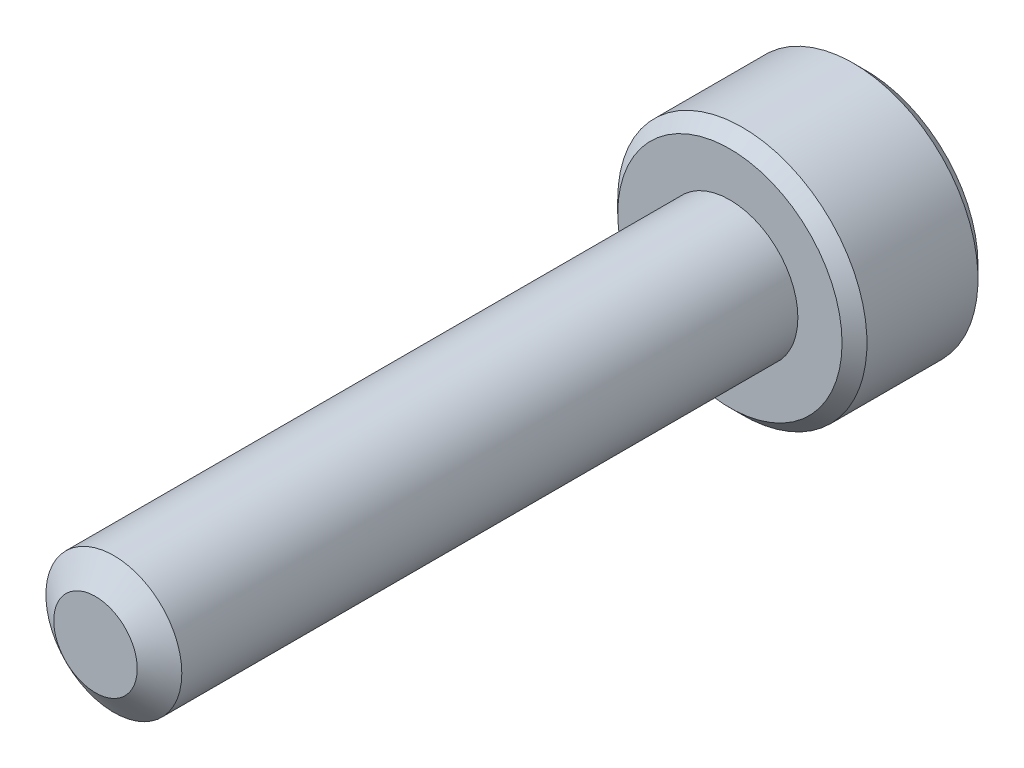
ISO-10303-21;
HEADER;
FILE_DESCRIPTION(('STEP AP214'),'2;1');
FILE_NAME('part.step','',(''),(''),'','','');
FILE_SCHEMA(('AUTOMOTIVE_DESIGN { 1 0 10303 214 1 1 1 1 }'));
ENDSEC;
DATA;
#1=APPLICATION_CONTEXT('core data for automotive mechanical design processes');
#2=APPLICATION_PROTOCOL_DEFINITION('international standard','automotive_design',2000,#1);
#3=PRODUCT_CONTEXT('',#1,'mechanical');
#4=PRODUCT('Part','Part','',(#3));
#5=PRODUCT_RELATED_PRODUCT_CATEGORY('part','',(#4));
#6=PRODUCT_DEFINITION_FORMATION('','',#4);
#7=PRODUCT_DEFINITION_CONTEXT('part definition',#1,'design');
#8=PRODUCT_DEFINITION('design','',#6,#7);
#9=PRODUCT_DEFINITION_SHAPE('','',#8);
#10=(LENGTH_UNIT() NAMED_UNIT(*) SI_UNIT(.MILLI.,.METRE.));
#11=(NAMED_UNIT(*) PLANE_ANGLE_UNIT() SI_UNIT($,.RADIAN.));
#12=(NAMED_UNIT(*) SI_UNIT($,.STERADIAN.) SOLID_ANGLE_UNIT());
#13=UNCERTAINTY_MEASURE_WITH_UNIT(LENGTH_MEASURE(1.E-05),#10,'distance_accuracy_value','');
#14=(GEOMETRIC_REPRESENTATION_CONTEXT(3) GLOBAL_UNCERTAINTY_ASSIGNED_CONTEXT((#13)) GLOBAL_UNIT_ASSIGNED_CONTEXT((#10,
#11,#12)) REPRESENTATION_CONTEXT('',''));
#15=CARTESIAN_POINT('',(0.,0.,0.));
#16=DIRECTION('',(0.,0.,1.));
#17=DIRECTION('',(1.,0.,0.));
#18=AXIS2_PLACEMENT_3D('',#15,#16,#17);
#19=CARTESIAN_POINT('',(0.,0.,-14.));
#20=DIRECTION('',(0.,0.,1.));
#21=DIRECTION('',(1.,0.,0.));
#22=AXIS2_PLACEMENT_3D('',#19,#20,#21);
#23=CYLINDRICAL_SURFACE('',#22,1.5);
#24=CARTESIAN_POINT('',(0.,0.,-14.));
#25=DIRECTION('',(0.,0.,-1.));
#26=DIRECTION('',(-1.,0.,0.));
#27=AXIS2_PLACEMENT_3D('',#24,#25,#26);
#28=CIRCLE('',#27,1.5);
#29=CARTESIAN_POINT('',(-1.5,0.,-14.));
#30=VERTEX_POINT('',#29);
#31=EDGE_CURVE('E217',#30,#30,#28,.F.);
#32=ORIENTED_EDGE('',*,*,#31,.T.);
#33=EDGE_LOOP('',(#32));
#34=FACE_BOUND('',#33,.T.);
#35=CARTESIAN_POINT('',(0.,0.,-0.40525178320938));
#36=DIRECTION('',(0.,0.,1.));
#37=DIRECTION('',(1.,0.,0.));
#38=AXIS2_PLACEMENT_3D('',#35,#36,#37);
#39=CIRCLE('',#38,1.5);
#40=CARTESIAN_POINT('',(1.5,0.,-0.40525178320938));
#41=VERTEX_POINT('',#40);
#42=EDGE_CURVE('E111',#41,#41,#39,.T.);
#43=ORIENTED_EDGE('',*,*,#42,.F.);
#44=EDGE_LOOP('',(#43));
#45=FACE_BOUND('',#44,.T.);
#46=ADVANCED_FACE('F37',(#34,#45),#23,.T.);
#47=CARTESIAN_POINT('',(0.,0.,0.));
#48=DIRECTION('',(0.,0.,-1.));
#49=DIRECTION('',(-1.,0.,0.));
#50=AXIS2_PLACEMENT_3D('',#47,#48,#49);
#51=CONICAL_SURFACE('',#50,0.921240473580834,0.959931088596884);
#52=ORIENTED_EDGE('',*,*,#42,.T.);
#53=EDGE_LOOP('',(#52));
#54=FACE_BOUND('',#53,.T.);
#55=CARTESIAN_POINT('',(0.,0.,0.));
#56=DIRECTION('',(0.,0.,1.));
#57=DIRECTION('',(1.,0.,0.));
#58=AXIS2_PLACEMENT_3D('',#55,#56,#57);
#59=CIRCLE('',#58,0.921240473580834);
#60=CARTESIAN_POINT('',(0.921240473580834,0.,0.));
#61=VERTEX_POINT('',#60);
#62=EDGE_CURVE('E215',#61,#61,#59,.T.);
#63=ORIENTED_EDGE('',*,*,#62,.F.);
#64=EDGE_LOOP('',(#63));
#65=FACE_BOUND('',#64,.T.);
#66=ADVANCED_FACE('F198',(#54,#65),#51,.T.);
#67=CARTESIAN_POINT('',(0.,0.,0.));
#68=DIRECTION('',(0.,0.,1.));
#69=DIRECTION('',(1.,0.,0.));
#70=AXIS2_PLACEMENT_3D('',#67,#68,#69);
#71=PLANE('',#70);
#72=ORIENTED_EDGE('',*,*,#62,.T.);
#73=EDGE_LOOP('',(#72));
#74=FACE_BOUND('',#73,.T.);
#75=ADVANCED_FACE('F195',(#74),#71,.T.);
#76=CARTESIAN_POINT('',(0.,0.,-17.));
#77=DIRECTION('',(0.,0.,1.));
#78=DIRECTION('',(1.,0.,0.));
#79=AXIS2_PLACEMENT_3D('',#76,#77,#78);
#80=CYLINDRICAL_SURFACE('',#79,2.75);
#81=CARTESIAN_POINT('',(0.,0.,-16.725));
#82=DIRECTION('',(0.,0.,-1.));
#83=DIRECTION('',(-1.,0.,0.));
#84=AXIS2_PLACEMENT_3D('',#81,#82,#83);
#85=CIRCLE('',#84,2.75);
#86=CARTESIAN_POINT('',(-2.75,0.,-16.725));
#87=VERTEX_POINT('',#86);
#88=EDGE_CURVE('E45',#87,#87,#85,.F.);
#89=ORIENTED_EDGE('',*,*,#88,.T.);
#90=EDGE_LOOP('',(#89));
#91=FACE_BOUND('',#90,.T.);
#92=CARTESIAN_POINT('',(0.,0.,-14.275));
#93=DIRECTION('',(0.,0.,-1.));
#94=DIRECTION('',(-1.,0.,0.));
#95=AXIS2_PLACEMENT_3D('',#92,#93,#94);
#96=CIRCLE('',#95,2.75);
#97=CARTESIAN_POINT('',(-2.75,0.,-14.275));
#98=VERTEX_POINT('',#97);
#99=EDGE_CURVE('E174',#98,#98,#96,.T.);
#100=ORIENTED_EDGE('',*,*,#99,.T.);
#101=EDGE_LOOP('',(#100));
#102=FACE_BOUND('',#101,.T.);
#103=ADVANCED_FACE('F179',(#91,#102),#80,.T.);
#104=CARTESIAN_POINT('',(0.,0.,-17.));
#105=DIRECTION('',(0.,0.,-1.));
#106=DIRECTION('',(-1.,0.,0.));
#107=AXIS2_PLACEMENT_3D('',#104,#105,#106);
#108=PLANE('',#107);
#109=CARTESIAN_POINT('',(0.,0.,-17.));
#110=DIRECTION('',(0.,0.,-1.));
#111=DIRECTION('',(-1.,0.,0.));
#112=AXIS2_PLACEMENT_3D('',#109,#110,#111);
#113=CIRCLE('',#112,2.475);
#114=CARTESIAN_POINT('',(-2.475,0.,-17.));
#115=VERTEX_POINT('',#114);
#116=EDGE_CURVE('E110',#115,#115,#113,.T.);
#117=ORIENTED_EDGE('',*,*,#116,.T.);
#118=EDGE_LOOP('',(#117));
#119=FACE_BOUND('',#118,.T.);
#120=CARTESIAN_POINT('',(0.,0.,-17.));
#121=DIRECTION('',(0.,0.,-1.));
#122=DIRECTION('',(-1.,0.,0.));
#123=AXIS2_PLACEMENT_3D('',#120,#121,#122);
#124=CIRCLE('',#123,1.44337567297406);
#125=CARTESIAN_POINT('',(-1.25,0.721687836487031,-17.));
#126=VERTEX_POINT('',#125);
#127=CARTESIAN_POINT('',(0.,1.44337567297406,-17.));
#128=VERTEX_POINT('',#127);
#129=EDGE_CURVE('E91',#126,#128,#124,.T.);
#130=ORIENTED_EDGE('',*,*,#129,.F.);
#131=CARTESIAN_POINT('',(-1.25,-0.721687836487032,-17.));
#132=VERTEX_POINT('',#131);
#133=EDGE_CURVE('E51',#132,#126,#124,.T.);
#134=ORIENTED_EDGE('',*,*,#133,.F.);
#135=CARTESIAN_POINT('',(0.,-1.44337567297406,-17.));
#136=VERTEX_POINT('',#135);
#137=EDGE_CURVE('E276',#136,#132,#124,.T.);
#138=ORIENTED_EDGE('',*,*,#137,.F.);
#139=CARTESIAN_POINT('',(1.25,-0.721687836487032,-17.));
#140=VERTEX_POINT('',#139);
#141=EDGE_CURVE('E58',#140,#136,#124,.T.);
#142=ORIENTED_EDGE('',*,*,#141,.F.);
#143=CARTESIAN_POINT('',(1.25,0.721687836487033,-17.));
#144=VERTEX_POINT('',#143);
#145=EDGE_CURVE('E132',#144,#140,#124,.T.);
#146=ORIENTED_EDGE('',*,*,#145,.F.);
#147=EDGE_CURVE('E100',#128,#144,#124,.T.);
#148=ORIENTED_EDGE('',*,*,#147,.F.);
#149=EDGE_LOOP('',(#130,#134,#138,#142,#146,#148));
#150=FACE_BOUND('',#149,.T.);
#151=ADVANCED_FACE('F131',(#119,#150),#108,.T.);
#152=CARTESIAN_POINT('',(0.,0.,-14.));
#153=DIRECTION('',(0.,0.,-1.));
#154=DIRECTION('',(-1.,0.,0.));
#155=AXIS2_PLACEMENT_3D('',#152,#153,#154);
#156=PLANE('',#155);
#157=CARTESIAN_POINT('',(0.,0.,-14.));
#158=DIRECTION('',(0.,0.,-1.));
#159=DIRECTION('',(-1.,0.,0.));
#160=AXIS2_PLACEMENT_3D('',#157,#158,#159);
#161=CIRCLE('',#160,2.475);
#162=CARTESIAN_POINT('',(-2.475,0.,-14.));
#163=VERTEX_POINT('',#162);
#164=EDGE_CURVE('E11',#163,#163,#161,.F.);
#165=ORIENTED_EDGE('',*,*,#164,.T.);
#166=EDGE_LOOP('',(#165));
#167=FACE_BOUND('',#166,.T.);
#168=ORIENTED_EDGE('',*,*,#31,.F.);
#169=EDGE_LOOP('',(#168));
#170=FACE_BOUND('',#169,.T.);
#171=ADVANCED_FACE('F188',(#167,#170),#156,.F.);
#172=CARTESIAN_POINT('',(0.,0.,-17.));
#173=DIRECTION('',(0.,0.,-1.));
#174=DIRECTION('',(-1.,0.,0.));
#175=AXIS2_PLACEMENT_3D('',#172,#173,#174);
#176=CONICAL_SURFACE('',#175,1.44337567297406,0.78539816339745);
#177=ORIENTED_EDGE('',*,*,#147,.T.);
#178=CARTESIAN_POINT('',(-0.000200000000000119,1.4434911430279,-17.0001154839091));
#179=CARTESIAN_POINT('',(0.042775167071586,1.41867941875065,-16.9753216680551));
#180=CARTESIAN_POINT('',(0.0864690047459468,1.39345276980743,-16.9519837344187));
#181=CARTESIAN_POINT('',(0.17556593084194,1.34201263554194,-16.9092520040845));
#182=CARTESIAN_POINT('',(0.220977498357061,1.31579425481277,-16.8898819923604));
#183=CARTESIAN_POINT('',(0.312547820935257,1.26292610442246,-16.8567004834135));
#184=CARTESIAN_POINT('',(0.358683240175882,1.23628980770471,-16.8428055590527));
#185=CARTESIAN_POINT('',(0.451970080407589,1.18243062538509,-16.8213972821606));
#186=CARTESIAN_POINT('',(0.499118649136376,1.15520938653762,-16.8138679415668));
#187=CARTESIAN_POINT('',(0.580373556887248,1.10829684367467,-16.8070744980507));
#188=CARTESIAN_POINT('',(0.614374876627936,1.08866617256958,-16.8060685591044));
#189=CARTESIAN_POINT('',(0.682317764432473,1.04943932800611,-16.8077614149113));
#190=CARTESIAN_POINT('',(0.716259317655653,1.029843163116,-16.8104610272155));
#191=CARTESIAN_POINT('',(0.783814856457495,0.990839954603502,-16.8194089303164));
#192=CARTESIAN_POINT('',(0.81742850728677,0.971433104248774,-16.8256605258997));
#193=CARTESIAN_POINT('',(0.884094638217808,0.932943395609908,-16.8413756814139));
#194=CARTESIAN_POINT('',(0.917146871030291,0.913860680098303,-16.8508406200875));
#195=CARTESIAN_POINT('',(1.00179969160026,0.86498635135457,-16.8789313906876));
#196=CARTESIAN_POINT('',(1.05286649242963,0.835502920149078,-16.8996701574522));
#197=CARTESIAN_POINT('',(1.15300085411325,0.777690319475909,-16.9463871346715));
#198=CARTESIAN_POINT('',(1.20207431157827,0.749357745598417,-16.9723482959468));
#199=CARTESIAN_POINT('',(1.2502,0.721572366433194,-17.0001154839091));
#200=B_SPLINE_CURVE_WITH_KNOTS('',3,(#178,#179,#180,#181,#182,#183,#184,#185,#186,#187,#188,
#189,#190,#191,#192,#193,#194,#195,#196,#197,#198,#199),.UNSPECIFIED.,.F.,.F.,(4,2,2,2,2,2,2,2,
2,2,4),(0.,0.166533409618302,0.334037607289759,0.498880396489695,0.66330791924027,
0.780963963458822,0.898645970148448,1.01643764860773,1.13427993171549,1.32148652032141,
1.50809158792574),.UNSPECIFIED.);
#201=EDGE_CURVE('E105',#128,#144,#200,.T.);
#202=ORIENTED_EDGE('',*,*,#201,.F.);
#203=EDGE_LOOP('',(#177,#202));
#204=FACE_BOUND('',#203,.T.);
#205=ADVANCED_FACE('F106',(#204),#176,.F.);
#206=ORIENTED_EDGE('',*,*,#145,.T.);
#207=CARTESIAN_POINT('',(1.25,-1.43934010808077,-17.4629820968923));
#208=CARTESIAN_POINT('',(1.25,-1.40429313005659,-17.4365249226329));
#209=CARTESIAN_POINT('',(1.25,-1.36905087135599,-17.4103271603543));
#210=CARTESIAN_POINT('',(1.25,-1.29809650706311,-17.3585575718396));
#211=CARTESIAN_POINT('',(1.25,-1.26238428576496,-17.3329859043563));
#212=CARTESIAN_POINT('',(1.25,-1.15390111792708,-17.2570059936895));
#213=CARTESIAN_POINT('',(1.25,-1.08031646726265,-17.2077402861896));
#214=CARTESIAN_POINT('',(1.25,-0.926012322755097,-17.1110258302631));
#215=CARTESIAN_POINT('',(1.25,-0.845125318656147,-17.0638412989418));
#216=CARTESIAN_POINT('',(1.25,-0.679311174076602,-16.9775307343904));
#217=CARTESIAN_POINT('',(1.25,-0.594398891026689,-16.9383775346269));
#218=CARTESIAN_POINT('',(1.25,-0.466944812460741,-16.8904772236883));
#219=CARTESIAN_POINT('',(1.25,-0.426289985812822,-16.8767294897863));
#220=CARTESIAN_POINT('',(1.25,-0.343998850091268,-16.8524979274505));
#221=CARTESIAN_POINT('',(1.25,-0.302362473614962,-16.8420143238698));
#222=CARTESIAN_POINT('',(1.25,-0.219052696285666,-16.8250301617483));
#223=CARTESIAN_POINT('',(1.25,-0.1773934284745,-16.8184613604714));
#224=CARTESIAN_POINT('',(1.25,-0.0936293693401925,-16.8094350534578));
#225=CARTESIAN_POINT('',(1.25,-0.0515246558543963,-16.8069768409973));
#226=CARTESIAN_POINT('',(1.25,0.0311890576306316,-16.8063540620133));
#227=CARTESIAN_POINT('',(1.25,0.0717969625499306,-16.8080371168463));
#228=CARTESIAN_POINT('',(1.25,0.152668636885198,-16.8152682705979));
#229=CARTESIAN_POINT('',(1.25,0.192932338835359,-16.8208171104131));
#230=CARTESIAN_POINT('',(1.25,0.273499879165296,-16.835571036465));
#231=CARTESIAN_POINT('',(1.25,0.313792180618512,-16.8448381759641));
#232=CARTESIAN_POINT('',(1.25,0.393496413911458,-16.8665361784573));
#233=CARTESIAN_POINT('',(1.25,0.432908419115059,-16.8789667767306));
#234=CARTESIAN_POINT('',(1.25,0.556992735862298,-16.9227793529314));
#235=CARTESIAN_POINT('',(1.25,0.639898924666085,-16.959151072876));
#236=CARTESIAN_POINT('',(1.25,0.801816555499701,-17.0400191621783));
#237=CARTESIAN_POINT('',(1.25,0.880812666325045,-17.084544720912));
#238=CARTESIAN_POINT('',(1.25,1.0317856127975,-17.1764048766666));
#239=CARTESIAN_POINT('',(1.25,1.10391618485086,-17.2234899339163));
#240=CARTESIAN_POINT('',(1.25,1.2101860604331,-17.2962785615985));
#241=CARTESIAN_POINT('',(1.25,1.24515069969379,-17.3207980853934));
#242=CARTESIAN_POINT('',(1.25,1.31460220852736,-17.3704856367657));
#243=CARTESIAN_POINT('',(1.25,1.34908920596618,-17.3956534854155));
#244=CARTESIAN_POINT('',(1.25,1.38337731682912,-17.4210901488412));
#245=B_SPLINE_CURVE_WITH_KNOTS('',3,(#207,#208,#209,#210,#211,#212,#213,#214,#215,#216,#217,
#218,#219,#220,#221,#222,#223,#224,#225,#226,#227,#228,#229,#230,#231,#232,#233,#234,#235,#236,
#237,#238,#239,#240,#241,#242,#243,#244),.UNSPECIFIED.,.F.,.F.,(4,2,2,2,2,2,2,2,2,2,2,2,2,2,2,2,
2,2,4),(0.,0.131732960381448,0.263498984161645,0.529042014455827,0.80974192613462,
1.08947609717225,1.21811634272577,1.34676544783901,1.47310084517844,1.59941451973785,
1.7211504216785,1.84290966131735,1.96679153905342,2.09066305366039,2.36146692896009,
2.63325989198491,2.89154668212279,3.01965734507713,3.14773302245628),.UNSPECIFIED.);
#246=EDGE_CURVE('E99',#144,#140,#245,.F.);
#247=ORIENTED_EDGE('',*,*,#246,.F.);
#248=EDGE_LOOP('',(#206,#247));
#249=FACE_BOUND('',#248,.T.);
#250=ADVANCED_FACE('F282',(#249),#176,.F.);
#251=ORIENTED_EDGE('',*,*,#141,.T.);
#252=CARTESIAN_POINT('',(1.2502,-0.721572366433195,-17.0001154839091));
#253=CARTESIAN_POINT('',(1.20722483292841,-0.746384090710444,-16.9753216680551));
#254=CARTESIAN_POINT('',(1.16353099525405,-0.771610739653665,-16.9519837344187));
#255=CARTESIAN_POINT('',(1.07443406915806,-0.823050873919155,-16.9092520040845));
#256=CARTESIAN_POINT('',(1.02902250164294,-0.849269254648334,-16.8898819923604));
#257=CARTESIAN_POINT('',(0.937452179064739,-0.902137405038636,-16.8567004834135));
#258=CARTESIAN_POINT('',(0.891316759824113,-0.928773701756388,-16.8428055590527));
#259=CARTESIAN_POINT('',(0.798029919592407,-0.982632884076014,-16.8213972821606));
#260=CARTESIAN_POINT('',(0.750881350863619,-1.00985412292348,-16.8138679415668));
#261=CARTESIAN_POINT('',(0.669626443112747,-1.05676666578643,-16.8070744980507));
#262=CARTESIAN_POINT('',(0.635625123372058,-1.07639733689152,-16.8060685591044));
#263=CARTESIAN_POINT('',(0.567682235567521,-1.11562418145499,-16.8077614149113));
#264=CARTESIAN_POINT('',(0.533740682344341,-1.1352203463451,-16.8104610272155));
#265=CARTESIAN_POINT('',(0.466185143542499,-1.1742235548576,-16.8194089303164));
#266=CARTESIAN_POINT('',(0.432571492713223,-1.19363040521233,-16.8256605258997));
#267=CARTESIAN_POINT('',(0.365905361782185,-1.23212011385119,-16.8413756814139));
#268=CARTESIAN_POINT('',(0.332853128969703,-1.2512028293628,-16.8508406200875));
#269=CARTESIAN_POINT('',(0.248200308399734,-1.30007715810653,-16.8789313906876));
#270=CARTESIAN_POINT('',(0.19713350757036,-1.32956058931202,-16.8996701574522));
#271=CARTESIAN_POINT('',(0.096999145886744,-1.38737318998519,-16.9463871346715));
#272=CARTESIAN_POINT('',(0.0479256884217298,-1.41570576386268,-16.9723482959468));
#273=CARTESIAN_POINT('',(-0.000199999999999849,-1.4434911430279,-17.0001154839091));
#274=B_SPLINE_CURVE_WITH_KNOTS('',3,(#252,#253,#254,#255,#256,#257,#258,#259,#260,#261,#262,
#263,#264,#265,#266,#267,#268,#269,#270,#271,#272,#273),.UNSPECIFIED.,.F.,.F.,(4,2,2,2,2,2,2,2,
2,2,4),(0.,0.166533409618304,0.334037607289763,0.4988803964897,0.663307919240276,
0.780963963458829,0.898645970148455,1.01643764860774,1.1342799317155,1.32148652032141,
1.50809158792574),.UNSPECIFIED.);
#275=EDGE_CURVE('E142',#140,#136,#274,.T.);
#276=ORIENTED_EDGE('',*,*,#275,.F.);
#277=EDGE_LOOP('',(#251,#276));
#278=FACE_BOUND('',#277,.T.);
#279=ADVANCED_FACE('F279',(#278),#176,.F.);
#280=ORIENTED_EDGE('',*,*,#137,.T.);
#281=CARTESIAN_POINT('',(0.000200000000000315,-1.4434911430279,-17.0001154839091));
#282=CARTESIAN_POINT('',(-0.0427751670715865,-1.41867941875065,-16.9753216680551));
#283=CARTESIAN_POINT('',(-0.0864690047459478,-1.39345276980743,-16.9519837344187));
#284=CARTESIAN_POINT('',(-0.175565930841942,-1.34201263554194,-16.9092520040845));
#285=CARTESIAN_POINT('',(-0.220977498357064,-1.31579425481276,-16.8898819923604));
#286=CARTESIAN_POINT('',(-0.312547820935261,-1.26292610442246,-16.8567004834135));
#287=CARTESIAN_POINT('',(-0.358683240175886,-1.23628980770471,-16.8428055590527));
#288=CARTESIAN_POINT('',(-0.451970080407593,-1.18243062538508,-16.8213972821606));
#289=CARTESIAN_POINT('',(-0.49911864913638,-1.15520938653761,-16.8138679415668));
#290=CARTESIAN_POINT('',(-0.580373556887253,-1.10829684367467,-16.8070744980507));
#291=CARTESIAN_POINT('',(-0.614374876627942,-1.08866617256958,-16.8060685591044));
#292=CARTESIAN_POINT('',(-0.682317764432478,-1.04943932800611,-16.8077614149113));
#293=CARTESIAN_POINT('',(-0.716259317655658,-1.02984316311599,-16.8104610272155));
#294=CARTESIAN_POINT('',(-0.783814856457501,-0.990839954603499,-16.8194089303164));
#295=CARTESIAN_POINT('',(-0.817428507286776,-0.971433104248771,-16.8256605258997));
#296=CARTESIAN_POINT('',(-0.884094638217814,-0.932943395609905,-16.8413756814139));
#297=CARTESIAN_POINT('',(-0.917146871030296,-0.9138606800983,-16.8508406200875));
#298=CARTESIAN_POINT('',(-1.00179969160027,-0.864986351354568,-16.8789313906876));
#299=CARTESIAN_POINT('',(-1.05286649242964,-0.835502920149076,-16.8996701574522));
#300=CARTESIAN_POINT('',(-1.15300085411326,-0.777690319475908,-16.9463871346715));
#301=CARTESIAN_POINT('',(-1.20207431157827,-0.749357745598416,-16.9723482959468));
#302=CARTESIAN_POINT('',(-1.2502,-0.721572366433194,-17.0001154839091));
#303=B_SPLINE_CURVE_WITH_KNOTS('',3,(#281,#282,#283,#284,#285,#286,#287,#288,#289,#290,#291,
#292,#293,#294,#295,#296,#297,#298,#299,#300,#301,#302),.UNSPECIFIED.,.F.,.F.,(4,2,2,2,2,2,2,2,
2,2,4),(0.,0.166533409618304,0.334037607289763,0.4988803964897,0.663307919240276,
0.780963963458828,0.898645970148455,1.01643764860773,1.1342799317155,1.32148652032141,
1.50809158792574),.UNSPECIFIED.);
#304=EDGE_CURVE('E253',#136,#132,#303,.T.);
#305=ORIENTED_EDGE('',*,*,#304,.F.);
#306=EDGE_LOOP('',(#280,#305));
#307=FACE_BOUND('',#306,.T.);
#308=ADVANCED_FACE('F278',(#307),#176,.F.);
#309=ORIENTED_EDGE('',*,*,#133,.T.);
#310=CARTESIAN_POINT('',(-1.25,-1.43934010829019,-17.4629820970504));
#311=CARTESIAN_POINT('',(-1.25,-1.40429313026013,-17.4365249227849));
#312=CARTESIAN_POINT('',(-1.25,-1.36905087155364,-17.4103271605002));
#313=CARTESIAN_POINT('',(-1.25,-1.29809650724891,-17.3585575719734));
#314=CARTESIAN_POINT('',(-1.25,-1.2623842859448,-17.3329859044841));
#315=CARTESIAN_POINT('',(-1.25,-1.1539011180887,-17.257005993799));
#316=CARTESIAN_POINT('',(-1.25,-1.08031646741187,-17.207740286287));
#317=CARTESIAN_POINT('',(-1.25,-0.926012322877302,-17.1110258303356));
#318=CARTESIAN_POINT('',(-1.25,-0.845125318763649,-17.0638412990016));
#319=CARTESIAN_POINT('',(-1.25,-0.679311174153444,-16.9775307344266));
#320=CARTESIAN_POINT('',(-1.25,-0.594398891087585,-16.9383775346522));
#321=CARTESIAN_POINT('',(-1.25,-0.46694481250964,-16.8904772237056));
#322=CARTESIAN_POINT('',(-1.25,-0.426289985866746,-16.8767294898039));
#323=CARTESIAN_POINT('',(-1.25,-0.343998850155404,-16.8524979274677));
#324=CARTESIAN_POINT('',(-1.25,-0.302362473684287,-16.8420143238863));
#325=CARTESIAN_POINT('',(-1.25,-0.219052696365196,-16.8250301617622));
#326=CARTESIAN_POINT('',(-1.25,-0.177393428559045,-16.8184613604834));
#327=CARTESIAN_POINT('',(-1.25,-0.093629369434599,-16.809435053465));
#328=CARTESIAN_POINT('',(-1.25,-0.0515246559536496,-16.8069768410015));
#329=CARTESIAN_POINT('',(-1.25,0.0311890575224381,-16.8063540620107));
#330=CARTESIAN_POINT('',(-1.25,0.0717969624376315,-16.8080371168399));
#331=CARTESIAN_POINT('',(-1.25,0.152668636765092,-16.8152682705835));
#332=CARTESIAN_POINT('',(-1.25,0.192932338711553,-16.8208171103943));
#333=CARTESIAN_POINT('',(-1.25,0.273499879034188,-16.835571036437));
#334=CARTESIAN_POINT('',(-1.25,0.313792180483814,-16.8448381759314));
#335=CARTESIAN_POINT('',(-1.25,0.393496413769925,-16.8665361784149));
#336=CARTESIAN_POINT('',(-1.25,0.432908418970282,-16.8789667766833));
#337=CARTESIAN_POINT('',(-1.25,0.556992735685996,-16.9227793528609));
#338=CARTESIAN_POINT('',(-1.25,0.639898924463081,-16.9591510727842));
#339=CARTESIAN_POINT('',(-1.25,0.801816555245345,-17.0400191620416));
#340=CARTESIAN_POINT('',(-1.25,0.88081266604605,-17.0845447207516));
#341=CARTESIAN_POINT('',(-1.25,1.03178561247421,-17.176404876461));
#342=CARTESIAN_POINT('',(-1.25,1.10391618450775,-17.2234899336892));
#343=CARTESIAN_POINT('',(-1.25,1.2101860600607,-17.2962785613395));
#344=CARTESIAN_POINT('',(-1.25,1.24515069931176,-17.3207980851238));
#345=CARTESIAN_POINT('',(-1.25,1.31460220812614,-17.3704856364749));
#346=CARTESIAN_POINT('',(-1.25,1.34908920555539,-17.3956534851142));
#347=CARTESIAN_POINT('',(-1.25,1.38337731640878,-17.4210901485293));
#348=B_SPLINE_CURVE_WITH_KNOTS('',3,(#310,#311,#312,#313,#314,#315,#316,#317,#318,#319,#320,
#321,#322,#323,#324,#325,#326,#327,#328,#329,#330,#331,#332,#333,#334,#335,#336,#337,#338,#339,
#340,#341,#342,#343,#344,#345,#346,#347),.UNSPECIFIED.,.F.,.F.,(4,2,2,2,2,2,2,2,2,2,2,2,2,2,2,2,
2,2,4),(0.,0.131732960406523,0.263498984211802,0.529042014557084,0.809741926293179,
1.08947609738757,1.21811634292656,1.34676544802529,1.47310084535082,1.59941451989631,
1.72115042182424,1.84290966145034,1.96679153917269,2.09066305376595,2.36146692896707,
2.63325989189266,2.89154668194564,3.01965734485811,3.14773302219539),.UNSPECIFIED.);
#349=EDGE_CURVE('E121',#132,#126,#348,.T.);
#350=ORIENTED_EDGE('',*,*,#349,.F.);
#351=EDGE_LOOP('',(#309,#350));
#352=FACE_BOUND('',#351,.T.);
#353=ADVANCED_FACE('F291',(#352),#176,.F.);
#354=ORIENTED_EDGE('',*,*,#129,.T.);
#355=CARTESIAN_POINT('',(-1.2502,0.721572366433194,-17.0001154839091));
#356=CARTESIAN_POINT('',(-1.20722483292841,0.746384090710444,-16.9753216680551));
#357=CARTESIAN_POINT('',(-1.16353099525405,0.771610739653664,-16.9519837344187));
#358=CARTESIAN_POINT('',(-1.07443406915806,0.823050873919153,-16.9092520040845));
#359=CARTESIAN_POINT('',(-1.02902250164294,0.849269254648332,-16.8898819923604));
#360=CARTESIAN_POINT('',(-0.937452179064743,0.902137405038634,-16.8567004834135));
#361=CARTESIAN_POINT('',(-0.891316759824117,0.928773701756385,-16.8428055590527));
#362=CARTESIAN_POINT('',(-0.79802991959241,0.982632884076011,-16.8213972821606));
#363=CARTESIAN_POINT('',(-0.750881350863623,1.00985412292348,-16.8138679415668));
#364=CARTESIAN_POINT('',(-0.669626443112751,1.05676666578643,-16.8070744980507));
#365=CARTESIAN_POINT('',(-0.635625123372062,1.07639733689152,-16.8060685591044));
#366=CARTESIAN_POINT('',(-0.567682235567526,1.11562418145498,-16.8077614149113));
#367=CARTESIAN_POINT('',(-0.533740682344346,1.1352203463451,-16.8104610272155));
#368=CARTESIAN_POINT('',(-0.466185143542504,1.1742235548576,-16.8194089303164));
#369=CARTESIAN_POINT('',(-0.432571492713228,1.19363040521232,-16.8256605258997));
#370=CARTESIAN_POINT('',(-0.36590536178219,1.23212011385119,-16.8413756814139));
#371=CARTESIAN_POINT('',(-0.332853128969708,1.25120282936279,-16.8508406200875));
#372=CARTESIAN_POINT('',(-0.248200308399738,1.30007715810653,-16.8789313906876));
#373=CARTESIAN_POINT('',(-0.197133507570364,1.32956058931202,-16.8996701574522));
#374=CARTESIAN_POINT('',(-0.0969991458867467,1.38737318998519,-16.9463871346715));
#375=CARTESIAN_POINT('',(-0.0479256884217312,1.41570576386268,-16.9723482959468));
#376=CARTESIAN_POINT('',(0.000200000000001136,1.4434911430279,-17.0001154839091));
#377=B_SPLINE_CURVE_WITH_KNOTS('',3,(#355,#356,#357,#358,#359,#360,#361,#362,#363,#364,#365,
#366,#367,#368,#369,#370,#371,#372,#373,#374,#375,#376),.UNSPECIFIED.,.F.,.F.,(4,2,2,2,2,2,2,2,
2,2,4),(0.,0.166533409618302,0.33403760728976,0.498880396489697,0.663307919240272,
0.780963963458824,0.89864597014845,1.01643764860773,1.13427993171549,1.32148652032141,
1.50809158792574),.UNSPECIFIED.);
#378=EDGE_CURVE('E95',#126,#128,#377,.T.);
#379=ORIENTED_EDGE('',*,*,#378,.F.);
#380=EDGE_LOOP('',(#354,#379));
#381=FACE_BOUND('',#380,.T.);
#382=ADVANCED_FACE('F93',(#381),#176,.F.);
#383=CARTESIAN_POINT('',(1.25,2.1650635094611,-15.125));
#384=DIRECTION('',(0.,0.,-1.));
#385=DIRECTION('',(-1.,0.,0.));
#386=AXIS2_PLACEMENT_3D('',#383,#384,#385);
#387=PLANE('',#386);
#388=DIRECTION('',(0.866025403784439,0.5,0.));
#389=VECTOR('',#388,1.);
#390=CARTESIAN_POINT('',(-1.25,0.721687836487032,-15.125));
#391=LINE('',#390,#389);
#392=CARTESIAN_POINT('',(-1.25,0.721687836487032,-15.125));
#393=VERTEX_POINT('',#392);
#394=CARTESIAN_POINT('',(0.,1.44337567297406,-15.125));
#395=VERTEX_POINT('',#394);
#396=EDGE_CURVE('E120',#393,#395,#391,.T.);
#397=ORIENTED_EDGE('',*,*,#396,.T.);
#398=DIRECTION('',(0.866025403784439,-0.5,0.));
#399=VECTOR('',#398,1.);
#400=CARTESIAN_POINT('',(0.,1.44337567297406,-15.125));
#401=LINE('',#400,#399);
#402=CARTESIAN_POINT('',(1.25,0.721687836487032,-15.125));
#403=VERTEX_POINT('',#402);
#404=EDGE_CURVE('E125',#395,#403,#401,.T.);
#405=ORIENTED_EDGE('',*,*,#404,.T.);
#406=DIRECTION('',(0.,-1.,0.));
#407=VECTOR('',#406,1.);
#408=CARTESIAN_POINT('',(1.25,0.721687836487032,-15.125));
#409=LINE('',#408,#407);
#410=CARTESIAN_POINT('',(1.25,-0.721687836487033,-15.125));
#411=VERTEX_POINT('',#410);
#412=EDGE_CURVE('E239',#403,#411,#409,.T.);
#413=ORIENTED_EDGE('',*,*,#412,.T.);
#414=DIRECTION('',(-0.866025403784439,-0.5,0.));
#415=VECTOR('',#414,1.);
#416=CARTESIAN_POINT('',(1.25,-0.721687836487033,-15.125));
#417=LINE('',#416,#415);
#418=CARTESIAN_POINT('',(0.,-1.44337567297406,-15.125));
#419=VERTEX_POINT('',#418);
#420=EDGE_CURVE('E236',#411,#419,#417,.T.);
#421=ORIENTED_EDGE('',*,*,#420,.T.);
#422=DIRECTION('',(-0.866025403784439,0.5,0.));
#423=VECTOR('',#422,1.);
#424=CARTESIAN_POINT('',(0.,-1.44337567297406,-15.125));
#425=LINE('',#424,#423);
#426=CARTESIAN_POINT('',(-1.25,-0.721687836487032,-15.125));
#427=VERTEX_POINT('',#426);
#428=EDGE_CURVE('E233',#419,#427,#425,.T.);
#429=ORIENTED_EDGE('',*,*,#428,.T.);
#430=DIRECTION('',(0.,1.,0.));
#431=VECTOR('',#430,1.);
#432=CARTESIAN_POINT('',(-1.25,-0.721687836487032,-15.125));
#433=LINE('',#432,#431);
#434=EDGE_CURVE('E128',#427,#393,#433,.T.);
#435=ORIENTED_EDGE('',*,*,#434,.T.);
#436=EDGE_LOOP('',(#397,#405,#413,#421,#429,#435));
#437=FACE_BOUND('',#436,.T.);
#438=ADVANCED_FACE('F162',(#437),#387,.T.);
#439=CARTESIAN_POINT('',(0.,1.44337567297406,-15.125));
#440=DIRECTION('',(0.5,0.866025403784439,0.));
#441=DIRECTION('',(-0.866025403784439,0.5,0.));
#442=AXIS2_PLACEMENT_3D('',#439,#440,#441);
#443=PLANE('',#442);
#444=DIRECTION('',(0.,0.,-1.));
#445=VECTOR('',#444,1.);
#446=CARTESIAN_POINT('',(0.,1.44337567297406,-15.125));
#447=LINE('',#446,#445);
#448=EDGE_CURVE('E117',#395,#128,#447,.T.);
#449=ORIENTED_EDGE('',*,*,#448,.T.);
#450=ORIENTED_EDGE('',*,*,#201,.T.);
#451=DIRECTION('',(0.,0.,-1.));
#452=VECTOR('',#451,1.);
#453=CARTESIAN_POINT('',(1.25,0.721687836487032,-15.125));
#454=LINE('',#453,#452);
#455=EDGE_CURVE('E127',#403,#144,#454,.T.);
#456=ORIENTED_EDGE('',*,*,#455,.F.);
#457=ORIENTED_EDGE('',*,*,#404,.F.);
#458=EDGE_LOOP('',(#449,#450,#456,#457));
#459=FACE_BOUND('',#458,.T.);
#460=ADVANCED_FACE('F123',(#459),#443,.F.);
#461=CARTESIAN_POINT('',(1.25,0.721687836487032,-15.125));
#462=DIRECTION('',(1.,0.,0.));
#463=DIRECTION('',(0.,0.,-1.));
#464=AXIS2_PLACEMENT_3D('',#461,#462,#463);
#465=PLANE('',#464);
#466=ORIENTED_EDGE('',*,*,#455,.T.);
#467=ORIENTED_EDGE('',*,*,#246,.T.);
#468=DIRECTION('',(0.,0.,-1.));
#469=VECTOR('',#468,1.);
#470=CARTESIAN_POINT('',(1.25,-0.721687836487033,-15.125));
#471=LINE('',#470,#469);
#472=EDGE_CURVE('E222',#411,#140,#471,.T.);
#473=ORIENTED_EDGE('',*,*,#472,.F.);
#474=ORIENTED_EDGE('',*,*,#412,.F.);
#475=EDGE_LOOP('',(#466,#467,#473,#474));
#476=FACE_BOUND('',#475,.T.);
#477=ADVANCED_FACE('F151',(#476),#465,.F.);
#478=CARTESIAN_POINT('',(1.25,-0.721687836487033,-15.125));
#479=DIRECTION('',(0.5,-0.866025403784439,0.));
#480=DIRECTION('',(0.866025403784439,0.5,0.));
#481=AXIS2_PLACEMENT_3D('',#478,#479,#480);
#482=PLANE('',#481);
#483=ORIENTED_EDGE('',*,*,#472,.T.);
#484=ORIENTED_EDGE('',*,*,#275,.T.);
#485=DIRECTION('',(0.,0.,-1.));
#486=VECTOR('',#485,1.);
#487=CARTESIAN_POINT('',(0.,-1.44337567297406,-15.125));
#488=LINE('',#487,#486);
#489=EDGE_CURVE('E225',#419,#136,#488,.T.);
#490=ORIENTED_EDGE('',*,*,#489,.F.);
#491=ORIENTED_EDGE('',*,*,#420,.F.);
#492=EDGE_LOOP('',(#483,#484,#490,#491));
#493=FACE_BOUND('',#492,.T.);
#494=ADVANCED_FACE('F155',(#493),#482,.F.);
#495=CARTESIAN_POINT('',(0.,-1.44337567297406,-15.125));
#496=DIRECTION('',(-0.5,-0.866025403784439,0.));
#497=DIRECTION('',(0.866025403784439,-0.5,0.));
#498=AXIS2_PLACEMENT_3D('',#495,#496,#497);
#499=PLANE('',#498);
#500=ORIENTED_EDGE('',*,*,#489,.T.);
#501=ORIENTED_EDGE('',*,*,#304,.T.);
#502=DIRECTION('',(0.,0.,-1.));
#503=VECTOR('',#502,1.);
#504=CARTESIAN_POINT('',(-1.25,-0.721687836487032,-15.125));
#505=LINE('',#504,#503);
#506=EDGE_CURVE('E228',#427,#132,#505,.T.);
#507=ORIENTED_EDGE('',*,*,#506,.F.);
#508=ORIENTED_EDGE('',*,*,#428,.F.);
#509=EDGE_LOOP('',(#500,#501,#507,#508));
#510=FACE_BOUND('',#509,.T.);
#511=ADVANCED_FACE('F261',(#510),#499,.F.);
#512=CARTESIAN_POINT('',(-1.25,-0.721687836487032,-15.125));
#513=DIRECTION('',(-1.,0.,0.));
#514=DIRECTION('',(0.,-1.,0.));
#515=AXIS2_PLACEMENT_3D('',#512,#513,#514);
#516=PLANE('',#515);
#517=ORIENTED_EDGE('',*,*,#506,.T.);
#518=ORIENTED_EDGE('',*,*,#349,.T.);
#519=DIRECTION('',(0.,0.,-1.));
#520=VECTOR('',#519,1.);
#521=CARTESIAN_POINT('',(-1.25,0.721687836487032,-15.125));
#522=LINE('',#521,#520);
#523=EDGE_CURVE('E119',#393,#126,#522,.T.);
#524=ORIENTED_EDGE('',*,*,#523,.F.);
#525=ORIENTED_EDGE('',*,*,#434,.F.);
#526=EDGE_LOOP('',(#517,#518,#524,#525));
#527=FACE_BOUND('',#526,.T.);
#528=ADVANCED_FACE('F258',(#527),#516,.F.);
#529=CARTESIAN_POINT('',(-1.25,0.721687836487032,-15.125));
#530=DIRECTION('',(-0.5,0.866025403784439,0.));
#531=DIRECTION('',(-0.866025403784439,-0.5,0.));
#532=AXIS2_PLACEMENT_3D('',#529,#530,#531);
#533=PLANE('',#532);
#534=ORIENTED_EDGE('',*,*,#523,.T.);
#535=ORIENTED_EDGE('',*,*,#378,.T.);
#536=ORIENTED_EDGE('',*,*,#448,.F.);
#537=ORIENTED_EDGE('',*,*,#396,.F.);
#538=EDGE_LOOP('',(#534,#535,#536,#537));
#539=FACE_BOUND('',#538,.T.);
#540=ADVANCED_FACE('F115',(#539),#533,.F.);
#541=CARTESIAN_POINT('',(0.,0.,-17.));
#542=DIRECTION('',(0.,0.,1.));
#543=DIRECTION('',(1.,0.,0.));
#544=AXIS2_PLACEMENT_3D('',#541,#542,#543);
#545=CONICAL_SURFACE('',#544,2.475,0.785398163397441);
#546=ORIENTED_EDGE('',*,*,#88,.F.);
#547=EDGE_LOOP('',(#546));
#548=FACE_BOUND('',#547,.T.);
#549=ORIENTED_EDGE('',*,*,#116,.F.);
#550=EDGE_LOOP('',(#549));
#551=FACE_BOUND('',#550,.T.);
#552=ADVANCED_FACE('F182',(#548,#551),#545,.T.);
#553=CARTESIAN_POINT('',(0.,0.,-14.275));
#554=DIRECTION('',(0.,0.,-1.));
#555=DIRECTION('',(-1.,0.,0.));
#556=AXIS2_PLACEMENT_3D('',#553,#554,#555);
#557=CONICAL_SURFACE('',#556,2.75,0.785398163397453);
#558=ORIENTED_EDGE('',*,*,#164,.F.);
#559=EDGE_LOOP('',(#558));
#560=FACE_BOUND('',#559,.T.);
#561=ORIENTED_EDGE('',*,*,#99,.F.);
#562=EDGE_LOOP('',(#561));
#563=FACE_BOUND('',#562,.T.);
#564=ADVANCED_FACE('F39',(#560,#563),#557,.T.);
#565=CLOSED_SHELL('',(#46,#66,#75,#103,#151,#171,#205,#250,#279,#308,#353,#382,#438,#460,#477,
#494,#511,#528,#540,#552,#564));
#566=MANIFOLD_SOLID_BREP('B2',#565);
#567=ADVANCED_BREP_SHAPE_REPRESENTATION('',(#18,#566),#14);
#568=SHAPE_DEFINITION_REPRESENTATION(#9,#567);
ENDSEC;
END-ISO-10303-21;
